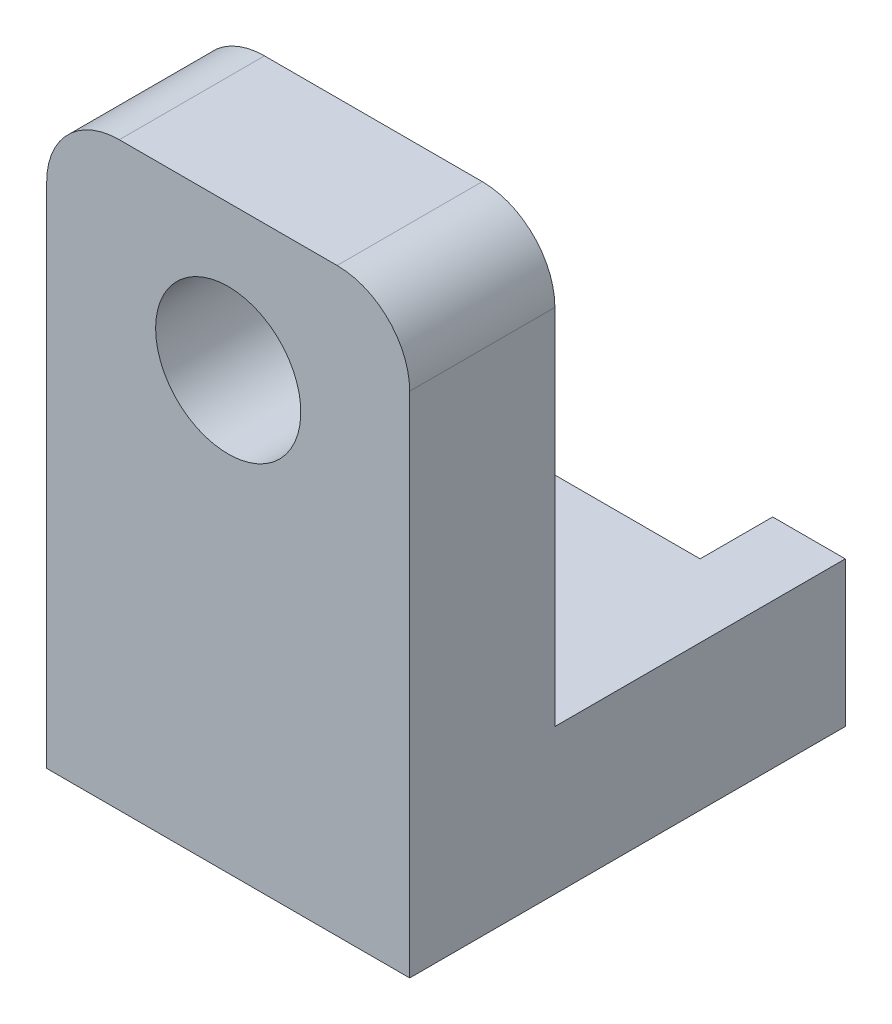
ISO-10303-21;
HEADER;
FILE_DESCRIPTION(('STEP AP214'),'2;1');
FILE_NAME('part.step','',(''),(''),'','','');
FILE_SCHEMA(('AUTOMOTIVE_DESIGN { 1 0 10303 214 1 1 1 1 }'));
ENDSEC;
DATA;
#1=APPLICATION_CONTEXT('core data for automotive mechanical design processes');
#2=APPLICATION_PROTOCOL_DEFINITION('international standard','automotive_design',2000,#1);
#3=PRODUCT_CONTEXT('',#1,'mechanical');
#4=PRODUCT('Part','Part','',(#3));
#5=PRODUCT_RELATED_PRODUCT_CATEGORY('part','',(#4));
#6=PRODUCT_DEFINITION_FORMATION('','',#4);
#7=PRODUCT_DEFINITION_CONTEXT('part definition',#1,'design');
#8=PRODUCT_DEFINITION('design','',#6,#7);
#9=PRODUCT_DEFINITION_SHAPE('','',#8);
#10=(LENGTH_UNIT() NAMED_UNIT(*) SI_UNIT(.MILLI.,.METRE.));
#11=(NAMED_UNIT(*) PLANE_ANGLE_UNIT() SI_UNIT($,.RADIAN.));
#12=(NAMED_UNIT(*) SI_UNIT($,.STERADIAN.) SOLID_ANGLE_UNIT());
#13=UNCERTAINTY_MEASURE_WITH_UNIT(LENGTH_MEASURE(1.E-05),#10,'distance_accuracy_value','');
#14=(GEOMETRIC_REPRESENTATION_CONTEXT(3) GLOBAL_UNCERTAINTY_ASSIGNED_CONTEXT((#13)) GLOBAL_UNIT_ASSIGNED_CONTEXT((#10,
#11,#12)) REPRESENTATION_CONTEXT('',''));
#15=CARTESIAN_POINT('',(0.,0.,0.));
#16=DIRECTION('',(0.,0.,1.));
#17=DIRECTION('',(1.,0.,0.));
#18=AXIS2_PLACEMENT_3D('',#15,#16,#17);
#19=CARTESIAN_POINT('',(12.5,40.,-10.));
#20=DIRECTION('',(0.,0.,1.));
#21=DIRECTION('',(0.,-1.,0.));
#22=AXIS2_PLACEMENT_3D('',#19,#20,#21);
#23=PLANE('',#22);
#24=DIRECTION('',(0.,1.,0.));
#25=VECTOR('',#24,1.);
#26=CARTESIAN_POINT('',(-12.5,40.,-10.));
#27=LINE('',#26,#25);
#28=CARTESIAN_POINT('',(-12.5,10.,-10.));
#29=VERTEX_POINT('',#28);
#30=CARTESIAN_POINT('',(-12.5,35.,-10.));
#31=VERTEX_POINT('',#30);
#32=EDGE_CURVE('E211',#29,#31,#27,.T.);
#33=ORIENTED_EDGE('',*,*,#32,.T.);
#34=CARTESIAN_POINT('',(-7.5,35.,-10.));
#35=DIRECTION('',(0.,0.,1.));
#36=DIRECTION('',(0.,-1.,0.));
#37=AXIS2_PLACEMENT_3D('',#34,#35,#36);
#38=CIRCLE('',#37,5.);
#39=CARTESIAN_POINT('',(-7.5,40.,-10.));
#40=VERTEX_POINT('',#39);
#41=EDGE_CURVE('E52',#31,#40,#38,.F.);
#42=ORIENTED_EDGE('',*,*,#41,.T.);
#43=DIRECTION('',(-1.,0.,0.));
#44=VECTOR('',#43,1.);
#45=CARTESIAN_POINT('',(12.5,40.,-10.));
#46=LINE('',#45,#44);
#47=CARTESIAN_POINT('',(7.5,40.,-10.));
#48=VERTEX_POINT('',#47);
#49=EDGE_CURVE('E223',#48,#40,#46,.T.);
#50=ORIENTED_EDGE('',*,*,#49,.F.);
#51=CARTESIAN_POINT('',(7.5,35.,-10.));
#52=DIRECTION('',(0.,0.,1.));
#53=DIRECTION('',(0.,-1.,0.));
#54=AXIS2_PLACEMENT_3D('',#51,#52,#53);
#55=CIRCLE('',#54,5.);
#56=CARTESIAN_POINT('',(12.5,35.,-10.));
#57=VERTEX_POINT('',#56);
#58=EDGE_CURVE('E59',#48,#57,#55,.F.);
#59=ORIENTED_EDGE('',*,*,#58,.T.);
#60=DIRECTION('',(0.,1.,0.));
#61=VECTOR('',#60,1.);
#62=CARTESIAN_POINT('',(12.5,40.,-10.));
#63=LINE('',#62,#61);
#64=CARTESIAN_POINT('',(12.5,10.,-10.));
#65=VERTEX_POINT('',#64);
#66=EDGE_CURVE('E195',#65,#57,#63,.T.);
#67=ORIENTED_EDGE('',*,*,#66,.F.);
#68=DIRECTION('',(-1.,0.,0.));
#69=VECTOR('',#68,1.);
#70=CARTESIAN_POINT('',(12.5,10.,-10.));
#71=LINE('',#70,#69);
#72=EDGE_CURVE('E227',#65,#29,#71,.T.);
#73=ORIENTED_EDGE('',*,*,#72,.T.);
#74=EDGE_LOOP('',(#33,#42,#50,#59,#67,#73));
#75=FACE_BOUND('',#74,.T.);
#76=CARTESIAN_POINT('',(0.,30.,-10.));
#77=DIRECTION('',(0.,0.,-1.));
#78=DIRECTION('',(0.,1.,0.));
#79=AXIS2_PLACEMENT_3D('',#76,#77,#78);
#80=CIRCLE('',#79,5.);
#81=CARTESIAN_POINT('',(0.,35.,-10.));
#82=VERTEX_POINT('',#81);
#83=EDGE_CURVE('E168',#82,#82,#80,.T.);
#84=ORIENTED_EDGE('',*,*,#83,.F.);
#85=EDGE_LOOP('',(#84));
#86=FACE_BOUND('',#85,.T.);
#87=ADVANCED_FACE('F43',(#75,#86),#23,.F.);
#88=CARTESIAN_POINT('',(12.5,0.,-30.));
#89=DIRECTION('',(0.,1.,0.));
#90=DIRECTION('',(0.,0.,1.));
#91=AXIS2_PLACEMENT_3D('',#88,#89,#90);
#92=PLANE('',#91);
#93=DIRECTION('',(0.,0.,-1.));
#94=VECTOR('',#93,1.);
#95=CARTESIAN_POINT('',(-7.5,0.,0.));
#96=LINE('',#95,#94);
#97=CARTESIAN_POINT('',(-7.5,0.,-25.));
#98=VERTEX_POINT('',#97);
#99=CARTESIAN_POINT('',(-7.5,0.,-30.));
#100=VERTEX_POINT('',#99);
#101=EDGE_CURVE('E140',#98,#100,#96,.T.);
#102=ORIENTED_EDGE('',*,*,#101,.F.);
#103=DIRECTION('',(1.,0.,0.));
#104=VECTOR('',#103,1.);
#105=CARTESIAN_POINT('',(0.,0.,-25.));
#106=LINE('',#105,#104);
#107=CARTESIAN_POINT('',(7.5,0.,-25.));
#108=VERTEX_POINT('',#107);
#109=EDGE_CURVE('E151',#98,#108,#106,.T.);
#110=ORIENTED_EDGE('',*,*,#109,.T.);
#111=DIRECTION('',(0.,0.,-1.));
#112=VECTOR('',#111,1.);
#113=CARTESIAN_POINT('',(7.5,0.,0.));
#114=LINE('',#113,#112);
#115=CARTESIAN_POINT('',(7.5,0.,-30.));
#116=VERTEX_POINT('',#115);
#117=EDGE_CURVE('E148',#108,#116,#114,.T.);
#118=ORIENTED_EDGE('',*,*,#117,.T.);
#119=DIRECTION('',(-1.,0.,0.));
#120=VECTOR('',#119,1.);
#121=CARTESIAN_POINT('',(12.5,0.,-30.));
#122=LINE('',#121,#120);
#123=CARTESIAN_POINT('',(12.5,0.,-30.));
#124=VERTEX_POINT('',#123);
#125=EDGE_CURVE('E236',#124,#116,#122,.T.);
#126=ORIENTED_EDGE('',*,*,#125,.F.);
#127=DIRECTION('',(0.,0.,-1.));
#128=VECTOR('',#127,1.);
#129=CARTESIAN_POINT('',(12.5,0.,-30.));
#130=LINE('',#129,#128);
#131=CARTESIAN_POINT('',(12.5,0.,0.));
#132=VERTEX_POINT('',#131);
#133=EDGE_CURVE('E184',#132,#124,#130,.T.);
#134=ORIENTED_EDGE('',*,*,#133,.F.);
#135=DIRECTION('',(-1.,0.,0.));
#136=VECTOR('',#135,1.);
#137=CARTESIAN_POINT('',(12.5,0.,0.));
#138=LINE('',#137,#136);
#139=CARTESIAN_POINT('',(-12.5,0.,0.));
#140=VERTEX_POINT('',#139);
#141=EDGE_CURVE('E201',#132,#140,#138,.T.);
#142=ORIENTED_EDGE('',*,*,#141,.T.);
#143=DIRECTION('',(0.,0.,-1.));
#144=VECTOR('',#143,1.);
#145=CARTESIAN_POINT('',(-12.5,0.,-30.));
#146=LINE('',#145,#144);
#147=CARTESIAN_POINT('',(-12.5,0.,-30.));
#148=VERTEX_POINT('',#147);
#149=EDGE_CURVE('E177',#140,#148,#146,.T.);
#150=ORIENTED_EDGE('',*,*,#149,.T.);
#151=EDGE_CURVE('E162',#100,#148,#122,.T.);
#152=ORIENTED_EDGE('',*,*,#151,.F.);
#153=EDGE_LOOP('',(#102,#110,#118,#126,#134,#142,#150,#152));
#154=FACE_BOUND('',#153,.T.);
#155=ADVANCED_FACE('F160',(#154),#92,.F.);
#156=CARTESIAN_POINT('',(12.5,10.,-30.));
#157=DIRECTION('',(0.,0.,1.));
#158=DIRECTION('',(1.,0.,0.));
#159=AXIS2_PLACEMENT_3D('',#156,#157,#158);
#160=PLANE('',#159);
#161=DIRECTION('',(0.,1.,0.));
#162=VECTOR('',#161,1.);
#163=CARTESIAN_POINT('',(-7.5,0.,-30.));
#164=LINE('',#163,#162);
#165=CARTESIAN_POINT('',(-7.5,10.,-30.));
#166=VERTEX_POINT('',#165);
#167=EDGE_CURVE('E174',#100,#166,#164,.T.);
#168=ORIENTED_EDGE('',*,*,#167,.F.);
#169=ORIENTED_EDGE('',*,*,#151,.T.);
#170=DIRECTION('',(0.,1.,0.));
#171=VECTOR('',#170,1.);
#172=CARTESIAN_POINT('',(-12.5,10.,-30.));
#173=LINE('',#172,#171);
#174=CARTESIAN_POINT('',(-12.5,10.,-30.));
#175=VERTEX_POINT('',#174);
#176=EDGE_CURVE('E204',#148,#175,#173,.T.);
#177=ORIENTED_EDGE('',*,*,#176,.T.);
#178=DIRECTION('',(-1.,0.,0.));
#179=VECTOR('',#178,1.);
#180=CARTESIAN_POINT('',(12.5,10.,-30.));
#181=LINE('',#180,#179);
#182=EDGE_CURVE('E231',#166,#175,#181,.T.);
#183=ORIENTED_EDGE('',*,*,#182,.F.);
#184=EDGE_LOOP('',(#168,#169,#177,#183));
#185=FACE_BOUND('',#184,.T.);
#186=ADVANCED_FACE('F299',(#185),#160,.F.);
#187=CARTESIAN_POINT('',(12.5,10.,-10.));
#188=DIRECTION('',(0.,-1.,0.));
#189=DIRECTION('',(0.,0.,-1.));
#190=AXIS2_PLACEMENT_3D('',#187,#188,#189);
#191=PLANE('',#190);
#192=DIRECTION('',(0.,0.,1.));
#193=VECTOR('',#192,1.);
#194=CARTESIAN_POINT('',(-7.5,10.,-10.));
#195=LINE('',#194,#193);
#196=CARTESIAN_POINT('',(-7.5,10.,-25.));
#197=VERTEX_POINT('',#196);
#198=EDGE_CURVE('E143',#166,#197,#195,.T.);
#199=ORIENTED_EDGE('',*,*,#198,.F.);
#200=ORIENTED_EDGE('',*,*,#182,.T.);
#201=DIRECTION('',(0.,0.,1.));
#202=VECTOR('',#201,1.);
#203=CARTESIAN_POINT('',(-12.5,10.,-10.));
#204=LINE('',#203,#202);
#205=EDGE_CURVE('E208',#175,#29,#204,.T.);
#206=ORIENTED_EDGE('',*,*,#205,.T.);
#207=ORIENTED_EDGE('',*,*,#72,.F.);
#208=DIRECTION('',(0.,0.,1.));
#209=VECTOR('',#208,1.);
#210=CARTESIAN_POINT('',(12.5,10.,-10.));
#211=LINE('',#210,#209);
#212=CARTESIAN_POINT('',(12.5,10.,-30.));
#213=VERTEX_POINT('',#212);
#214=EDGE_CURVE('E192',#213,#65,#211,.T.);
#215=ORIENTED_EDGE('',*,*,#214,.F.);
#216=CARTESIAN_POINT('',(7.5,10.,-30.));
#217=VERTEX_POINT('',#216);
#218=EDGE_CURVE('E232',#213,#217,#181,.T.);
#219=ORIENTED_EDGE('',*,*,#218,.T.);
#220=DIRECTION('',(0.,0.,1.));
#221=VECTOR('',#220,1.);
#222=CARTESIAN_POINT('',(7.5,10.,-10.));
#223=LINE('',#222,#221);
#224=CARTESIAN_POINT('',(7.5,10.,-25.));
#225=VERTEX_POINT('',#224);
#226=EDGE_CURVE('E243',#217,#225,#223,.T.);
#227=ORIENTED_EDGE('',*,*,#226,.T.);
#228=DIRECTION('',(-1.,0.,0.));
#229=VECTOR('',#228,1.);
#230=CARTESIAN_POINT('',(12.5,10.,-25.));
#231=LINE('',#230,#229);
#232=EDGE_CURVE('E240',#225,#197,#231,.T.);
#233=ORIENTED_EDGE('',*,*,#232,.T.);
#234=EDGE_LOOP('',(#199,#200,#206,#207,#215,#219,#227,#233));
#235=FACE_BOUND('',#234,.T.);
#236=ADVANCED_FACE('F304',(#235),#191,.F.);
#237=ORIENTED_EDGE('',*,*,#125,.T.);
#238=DIRECTION('',(0.,1.,0.));
#239=VECTOR('',#238,1.);
#240=CARTESIAN_POINT('',(7.5,0.,-30.));
#241=LINE('',#240,#239);
#242=EDGE_CURVE('E178',#116,#217,#241,.T.);
#243=ORIENTED_EDGE('',*,*,#242,.T.);
#244=ORIENTED_EDGE('',*,*,#218,.F.);
#245=DIRECTION('',(0.,1.,0.));
#246=VECTOR('',#245,1.);
#247=CARTESIAN_POINT('',(12.5,10.,-30.));
#248=LINE('',#247,#246);
#249=EDGE_CURVE('E188',#124,#213,#248,.T.);
#250=ORIENTED_EDGE('',*,*,#249,.F.);
#251=EDGE_LOOP('',(#237,#243,#244,#250));
#252=FACE_BOUND('',#251,.T.);
#253=ADVANCED_FACE('F307',(#252),#160,.F.);
#254=CARTESIAN_POINT('',(12.5,40.,0.));
#255=DIRECTION('',(0.,-1.,0.));
#256=DIRECTION('',(0.,0.,-1.));
#257=AXIS2_PLACEMENT_3D('',#254,#255,#256);
#258=PLANE('',#257);
#259=ORIENTED_EDGE('',*,*,#49,.T.);
#260=DIRECTION('',(0.,0.,1.));
#261=VECTOR('',#260,1.);
#262=CARTESIAN_POINT('',(-7.5,40.,0.));
#263=LINE('',#262,#261);
#264=CARTESIAN_POINT('',(-7.5,40.,0.));
#265=VERTEX_POINT('',#264);
#266=EDGE_CURVE('E252',#40,#265,#263,.T.);
#267=ORIENTED_EDGE('',*,*,#266,.T.);
#268=DIRECTION('',(-1.,0.,0.));
#269=VECTOR('',#268,1.);
#270=CARTESIAN_POINT('',(12.5,40.,0.));
#271=LINE('',#270,#269);
#272=CARTESIAN_POINT('',(7.5,40.,0.));
#273=VERTEX_POINT('',#272);
#274=EDGE_CURVE('E219',#273,#265,#271,.T.);
#275=ORIENTED_EDGE('',*,*,#274,.F.);
#276=DIRECTION('',(0.,0.,1.));
#277=VECTOR('',#276,1.);
#278=CARTESIAN_POINT('',(7.5,40.,0.));
#279=LINE('',#278,#277);
#280=EDGE_CURVE('E249',#273,#48,#279,.F.);
#281=ORIENTED_EDGE('',*,*,#280,.T.);
#282=EDGE_LOOP('',(#259,#267,#275,#281));
#283=FACE_BOUND('',#282,.T.);
#284=ADVANCED_FACE('F271',(#283),#258,.F.);
#285=CARTESIAN_POINT('',(12.5,0.,0.));
#286=DIRECTION('',(0.,0.,-1.));
#287=DIRECTION('',(-1.,0.,0.));
#288=AXIS2_PLACEMENT_3D('',#285,#286,#287);
#289=PLANE('',#288);
#290=CARTESIAN_POINT('',(0.,30.,0.));
#291=DIRECTION('',(0.,0.,-1.));
#292=DIRECTION('',(-1.,0.,0.));
#293=AXIS2_PLACEMENT_3D('',#290,#291,#292);
#294=CIRCLE('',#293,5.);
#295=CARTESIAN_POINT('',(-5.,30.,0.));
#296=VERTEX_POINT('',#295);
#297=EDGE_CURVE('E164',#296,#296,#294,.T.);
#298=ORIENTED_EDGE('',*,*,#297,.T.);
#299=EDGE_LOOP('',(#298));
#300=FACE_BOUND('',#299,.T.);
#301=ORIENTED_EDGE('',*,*,#274,.T.);
#302=CARTESIAN_POINT('',(-7.5,35.,0.));
#303=DIRECTION('',(0.,0.,-1.));
#304=DIRECTION('',(-1.,0.,0.));
#305=AXIS2_PLACEMENT_3D('',#302,#303,#304);
#306=CIRCLE('',#305,5.);
#307=CARTESIAN_POINT('',(-12.5,35.,0.));
#308=VERTEX_POINT('',#307);
#309=EDGE_CURVE('E259',#265,#308,#306,.F.);
#310=ORIENTED_EDGE('',*,*,#309,.T.);
#311=DIRECTION('',(0.,-1.,0.));
#312=VECTOR('',#311,1.);
#313=CARTESIAN_POINT('',(-12.5,0.,0.));
#314=LINE('',#313,#312);
#315=EDGE_CURVE('E189',#308,#140,#314,.T.);
#316=ORIENTED_EDGE('',*,*,#315,.T.);
#317=ORIENTED_EDGE('',*,*,#141,.F.);
#318=DIRECTION('',(0.,-1.,0.));
#319=VECTOR('',#318,1.);
#320=CARTESIAN_POINT('',(12.5,0.,0.));
#321=LINE('',#320,#319);
#322=CARTESIAN_POINT('',(12.5,35.,0.));
#323=VERTEX_POINT('',#322);
#324=EDGE_CURVE('E198',#323,#132,#321,.T.);
#325=ORIENTED_EDGE('',*,*,#324,.F.);
#326=CARTESIAN_POINT('',(7.5,35.,0.));
#327=DIRECTION('',(0.,0.,-1.));
#328=DIRECTION('',(-1.,0.,0.));
#329=AXIS2_PLACEMENT_3D('',#326,#327,#328);
#330=CIRCLE('',#329,5.);
#331=EDGE_CURVE('E256',#323,#273,#330,.F.);
#332=ORIENTED_EDGE('',*,*,#331,.T.);
#333=EDGE_LOOP('',(#301,#310,#316,#317,#325,#332));
#334=FACE_BOUND('',#333,.T.);
#335=ADVANCED_FACE('F276',(#300,#334),#289,.F.);
#336=CARTESIAN_POINT('',(12.5,0.,0.));
#337=DIRECTION('',(-1.,0.,0.));
#338=DIRECTION('',(0.,0.,1.));
#339=AXIS2_PLACEMENT_3D('',#336,#337,#338);
#340=PLANE('',#339);
#341=ORIENTED_EDGE('',*,*,#66,.T.);
#342=DIRECTION('',(0.,0.,1.));
#343=VECTOR('',#342,1.);
#344=CARTESIAN_POINT('',(12.5,35.,0.));
#345=LINE('',#344,#343);
#346=EDGE_CURVE('E11',#57,#323,#345,.T.);
#347=ORIENTED_EDGE('',*,*,#346,.T.);
#348=ORIENTED_EDGE('',*,*,#324,.T.);
#349=ORIENTED_EDGE('',*,*,#133,.T.);
#350=ORIENTED_EDGE('',*,*,#249,.T.);
#351=ORIENTED_EDGE('',*,*,#214,.T.);
#352=EDGE_LOOP('',(#341,#347,#348,#349,#350,#351));
#353=FACE_BOUND('',#352,.T.);
#354=ADVANCED_FACE('F286',(#353),#340,.F.);
#355=CARTESIAN_POINT('',(-12.5,0.,0.));
#356=DIRECTION('',(-1.,0.,0.));
#357=DIRECTION('',(0.,0.,1.));
#358=AXIS2_PLACEMENT_3D('',#355,#356,#357);
#359=PLANE('',#358);
#360=ORIENTED_EDGE('',*,*,#315,.F.);
#361=DIRECTION('',(0.,0.,1.));
#362=VECTOR('',#361,1.);
#363=CARTESIAN_POINT('',(-12.5,35.,-10.));
#364=LINE('',#363,#362);
#365=EDGE_CURVE('E67',#308,#31,#364,.F.);
#366=ORIENTED_EDGE('',*,*,#365,.T.);
#367=ORIENTED_EDGE('',*,*,#32,.F.);
#368=ORIENTED_EDGE('',*,*,#205,.F.);
#369=ORIENTED_EDGE('',*,*,#176,.F.);
#370=ORIENTED_EDGE('',*,*,#149,.F.);
#371=EDGE_LOOP('',(#360,#366,#367,#368,#369,#370));
#372=FACE_BOUND('',#371,.T.);
#373=ADVANCED_FACE('F279',(#372),#359,.T.);
#374=CARTESIAN_POINT('',(-7.5,0.,0.));
#375=DIRECTION('',(1.,0.,0.));
#376=DIRECTION('',(0.,0.,-1.));
#377=AXIS2_PLACEMENT_3D('',#374,#375,#376);
#378=PLANE('',#377);
#379=ORIENTED_EDGE('',*,*,#198,.T.);
#380=DIRECTION('',(0.,1.,0.));
#381=VECTOR('',#380,1.);
#382=CARTESIAN_POINT('',(-7.5,0.,-25.));
#383=LINE('',#382,#381);
#384=EDGE_CURVE('E136',#98,#197,#383,.T.);
#385=ORIENTED_EDGE('',*,*,#384,.F.);
#386=ORIENTED_EDGE('',*,*,#101,.T.);
#387=ORIENTED_EDGE('',*,*,#167,.T.);
#388=EDGE_LOOP('',(#379,#385,#386,#387));
#389=FACE_BOUND('',#388,.T.);
#390=ADVANCED_FACE('F138',(#389),#378,.T.);
#391=CARTESIAN_POINT('',(7.5,0.,0.));
#392=DIRECTION('',(1.,0.,0.));
#393=DIRECTION('',(0.,0.,-1.));
#394=AXIS2_PLACEMENT_3D('',#391,#392,#393);
#395=PLANE('',#394);
#396=ORIENTED_EDGE('',*,*,#242,.F.);
#397=ORIENTED_EDGE('',*,*,#117,.F.);
#398=DIRECTION('',(0.,1.,0.));
#399=VECTOR('',#398,1.);
#400=CARTESIAN_POINT('',(7.5,0.,-25.));
#401=LINE('',#400,#399);
#402=EDGE_CURVE('E147',#108,#225,#401,.T.);
#403=ORIENTED_EDGE('',*,*,#402,.T.);
#404=ORIENTED_EDGE('',*,*,#226,.F.);
#405=EDGE_LOOP('',(#396,#397,#403,#404));
#406=FACE_BOUND('',#405,.T.);
#407=ADVANCED_FACE('F320',(#406),#395,.F.);
#408=CARTESIAN_POINT('',(0.,0.,-25.));
#409=DIRECTION('',(0.,0.,1.));
#410=DIRECTION('',(1.,0.,0.));
#411=AXIS2_PLACEMENT_3D('',#408,#409,#410);
#412=PLANE('',#411);
#413=ORIENTED_EDGE('',*,*,#402,.F.);
#414=ORIENTED_EDGE('',*,*,#109,.F.);
#415=ORIENTED_EDGE('',*,*,#384,.T.);
#416=ORIENTED_EDGE('',*,*,#232,.F.);
#417=EDGE_LOOP('',(#413,#414,#415,#416));
#418=FACE_BOUND('',#417,.T.);
#419=ADVANCED_FACE('F152',(#418),#412,.F.);
#420=CARTESIAN_POINT('',(0.,30.,-10.));
#421=DIRECTION('',(0.,0.,-1.));
#422=DIRECTION('',(0.,1.,0.));
#423=AXIS2_PLACEMENT_3D('',#420,#421,#422);
#424=CYLINDRICAL_SURFACE('',#423,5.);
#425=ORIENTED_EDGE('',*,*,#297,.F.);
#426=EDGE_LOOP('',(#425));
#427=FACE_BOUND('',#426,.T.);
#428=ORIENTED_EDGE('',*,*,#83,.T.);
#429=EDGE_LOOP('',(#428));
#430=FACE_BOUND('',#429,.T.);
#431=ADVANCED_FACE('F293',(#427,#430),#424,.F.);
#432=CARTESIAN_POINT('',(-7.5,35.,0.));
#433=DIRECTION('',(0.,0.,-1.));
#434=DIRECTION('',(-1.,0.,0.));
#435=AXIS2_PLACEMENT_3D('',#432,#433,#434);
#436=CYLINDRICAL_SURFACE('',#435,5.);
#437=ORIENTED_EDGE('',*,*,#41,.F.);
#438=ORIENTED_EDGE('',*,*,#365,.F.);
#439=ORIENTED_EDGE('',*,*,#309,.F.);
#440=ORIENTED_EDGE('',*,*,#266,.F.);
#441=EDGE_LOOP('',(#437,#438,#439,#440));
#442=FACE_BOUND('',#441,.T.);
#443=ADVANCED_FACE('F274',(#442),#436,.T.);
#444=CARTESIAN_POINT('',(7.5,35.,0.));
#445=DIRECTION('',(0.,0.,1.));
#446=DIRECTION('',(1.,0.,0.));
#447=AXIS2_PLACEMENT_3D('',#444,#445,#446);
#448=CYLINDRICAL_SURFACE('',#447,5.);
#449=ORIENTED_EDGE('',*,*,#58,.F.);
#450=ORIENTED_EDGE('',*,*,#280,.F.);
#451=ORIENTED_EDGE('',*,*,#331,.F.);
#452=ORIENTED_EDGE('',*,*,#346,.F.);
#453=EDGE_LOOP('',(#449,#450,#451,#452));
#454=FACE_BOUND('',#453,.T.);
#455=ADVANCED_FACE('F45',(#454),#448,.T.);
#456=CLOSED_SHELL('',(#87,#155,#186,#236,#253,#284,#335,#354,#373,#390,#407,#419,#431,#443,#455));
#457=MANIFOLD_SOLID_BREP('B2',#456);
#458=ADVANCED_BREP_SHAPE_REPRESENTATION('',(#18,#457),#14);
#459=SHAPE_DEFINITION_REPRESENTATION(#9,#458);
ENDSEC;
END-ISO-10303-21;
